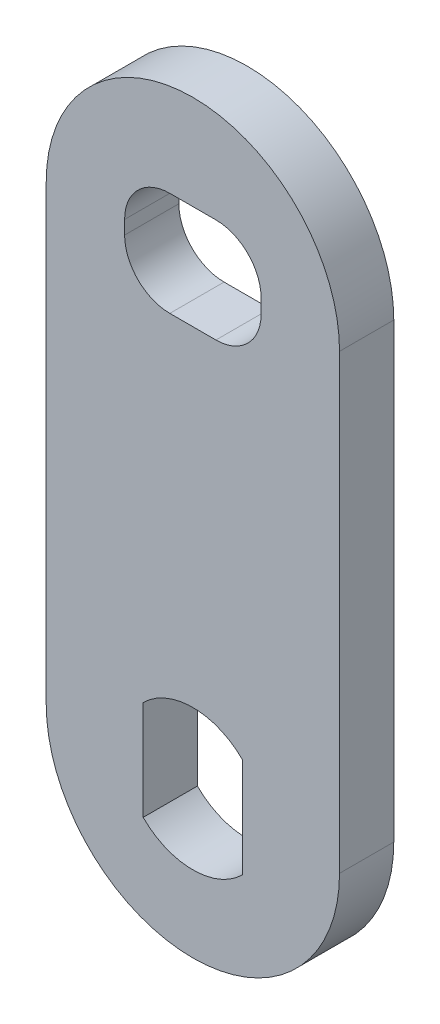
ISO-10303-21;
HEADER;
FILE_DESCRIPTION(('STEP AP214'),'2;1');
FILE_NAME('part.step','',(''),(''),'','','');
FILE_SCHEMA(('AUTOMOTIVE_DESIGN { 1 0 10303 214 1 1 1 1 }'));
ENDSEC;
DATA;
#1=APPLICATION_CONTEXT('core data for automotive mechanical design processes');
#2=APPLICATION_PROTOCOL_DEFINITION('international standard','automotive_design',2000,#1);
#3=PRODUCT_CONTEXT('',#1,'mechanical');
#4=PRODUCT('Part','Part','',(#3));
#5=PRODUCT_RELATED_PRODUCT_CATEGORY('part','',(#4));
#6=PRODUCT_DEFINITION_FORMATION('','',#4);
#7=PRODUCT_DEFINITION_CONTEXT('part definition',#1,'design');
#8=PRODUCT_DEFINITION('design','',#6,#7);
#9=PRODUCT_DEFINITION_SHAPE('','',#8);
#10=(LENGTH_UNIT() NAMED_UNIT(*) SI_UNIT(.MILLI.,.METRE.));
#11=(NAMED_UNIT(*) PLANE_ANGLE_UNIT() SI_UNIT($,.RADIAN.));
#12=(NAMED_UNIT(*) SI_UNIT($,.STERADIAN.) SOLID_ANGLE_UNIT());
#13=UNCERTAINTY_MEASURE_WITH_UNIT(LENGTH_MEASURE(1.E-05),#10,'distance_accuracy_value','');
#14=(GEOMETRIC_REPRESENTATION_CONTEXT(3) GLOBAL_UNCERTAINTY_ASSIGNED_CONTEXT((#13)) GLOBAL_UNIT_ASSIGNED_CONTEXT((#10,
#11,#12)) REPRESENTATION_CONTEXT('',''));
#15=CARTESIAN_POINT('',(0.,0.,0.));
#16=DIRECTION('',(0.,0.,1.));
#17=DIRECTION('',(1.,0.,0.));
#18=AXIS2_PLACEMENT_3D('',#15,#16,#17);
#19=CARTESIAN_POINT('',(0.,-12.5,3.));
#20=DIRECTION('',(0.,0.,1.));
#21=DIRECTION('',(1.,0.,0.));
#22=AXIS2_PLACEMENT_3D('',#19,#20,#21);
#23=PLANE('',#22);
#24=CARTESIAN_POINT('',(0.,-12.5,3.));
#25=DIRECTION('',(0.,0.,1.));
#26=DIRECTION('',(1.,0.,0.));
#27=AXIS2_PLACEMENT_3D('',#24,#25,#26);
#28=CIRCLE('',#27,3.88908729652601);
#29=CARTESIAN_POINT('',(-2.74999999999999,-15.25,3.));
#30=VERTEX_POINT('',#29);
#31=CARTESIAN_POINT('',(2.75000000000001,-15.25,3.));
#32=VERTEX_POINT('',#31);
#33=EDGE_CURVE('E47',#30,#32,#28,.T.);
#34=ORIENTED_EDGE('',*,*,#33,.F.);
#35=DIRECTION('',(0.,-1.,0.));
#36=VECTOR('',#35,1.);
#37=CARTESIAN_POINT('',(-2.74999999999999,-9.75,3.));
#38=LINE('',#37,#36);
#39=CARTESIAN_POINT('',(-2.74999999999999,-9.75,3.));
#40=VERTEX_POINT('',#39);
#41=EDGE_CURVE('E162',#40,#30,#38,.T.);
#42=ORIENTED_EDGE('',*,*,#41,.F.);
#43=CARTESIAN_POINT('',(0.,-12.5,3.));
#44=DIRECTION('',(0.,0.,1.));
#45=DIRECTION('',(1.,0.,0.));
#46=AXIS2_PLACEMENT_3D('',#43,#44,#45);
#47=CIRCLE('',#46,3.88908729652601);
#48=CARTESIAN_POINT('',(2.75000000000001,-9.75,3.));
#49=VERTEX_POINT('',#48);
#50=EDGE_CURVE('E165',#49,#40,#47,.T.);
#51=ORIENTED_EDGE('',*,*,#50,.F.);
#52=DIRECTION('',(0.,1.,0.));
#53=VECTOR('',#52,1.);
#54=CARTESIAN_POINT('',(2.75000000000001,-9.75,3.));
#55=LINE('',#54,#53);
#56=EDGE_CURVE('E171',#32,#49,#55,.T.);
#57=ORIENTED_EDGE('',*,*,#56,.F.);
#58=EDGE_LOOP('',(#34,#42,#51,#57));
#59=FACE_BOUND('',#58,.T.);
#60=CARTESIAN_POINT('',(0.,-12.5,3.));
#61=DIRECTION('',(0.,0.,1.));
#62=DIRECTION('',(1.,0.,0.));
#63=AXIS2_PLACEMENT_3D('',#60,#61,#62);
#64=CIRCLE('',#63,8.11);
#65=CARTESIAN_POINT('',(-8.10999999999999,-12.5,3.));
#66=VERTEX_POINT('',#65);
#67=CARTESIAN_POINT('',(8.11000000000001,-12.5,3.));
#68=VERTEX_POINT('',#67);
#69=EDGE_CURVE('E205',#66,#68,#64,.T.);
#70=ORIENTED_EDGE('',*,*,#69,.T.);
#71=DIRECTION('',(0.,1.,0.));
#72=VECTOR('',#71,1.);
#73=CARTESIAN_POINT('',(8.11000000000001,12.5,3.));
#74=LINE('',#73,#72);
#75=CARTESIAN_POINT('',(8.11000000000001,12.5,3.));
#76=VERTEX_POINT('',#75);
#77=EDGE_CURVE('E208',#68,#76,#74,.T.);
#78=ORIENTED_EDGE('',*,*,#77,.T.);
#79=CARTESIAN_POINT('',(0.,12.5,3.));
#80=DIRECTION('',(0.,0.,1.));
#81=DIRECTION('',(1.,0.,0.));
#82=AXIS2_PLACEMENT_3D('',#79,#80,#81);
#83=CIRCLE('',#82,8.11);
#84=CARTESIAN_POINT('',(-8.10999999999999,12.5,3.));
#85=VERTEX_POINT('',#84);
#86=EDGE_CURVE('E211',#76,#85,#83,.T.);
#87=ORIENTED_EDGE('',*,*,#86,.T.);
#88=DIRECTION('',(0.,-1.,0.));
#89=VECTOR('',#88,1.);
#90=CARTESIAN_POINT('',(-8.10999999999999,12.5,3.));
#91=LINE('',#90,#89);
#92=EDGE_CURVE('E213',#85,#66,#91,.T.);
#93=ORIENTED_EDGE('',*,*,#92,.T.);
#94=EDGE_LOOP('',(#70,#78,#87,#93));
#95=FACE_BOUND('',#94,.T.);
#96=DIRECTION('',(-1.,0.,0.));
#97=VECTOR('',#96,1.);
#98=CARTESIAN_POINT('',(-3.77499999999999,15.375,3.));
#99=LINE('',#98,#97);
#100=CARTESIAN_POINT('',(1.27500000000001,15.375,3.));
#101=VERTEX_POINT('',#100);
#102=CARTESIAN_POINT('',(-1.27499999999999,15.375,3.));
#103=VERTEX_POINT('',#102);
#104=EDGE_CURVE('E184',#101,#103,#99,.T.);
#105=ORIENTED_EDGE('',*,*,#104,.F.);
#106=CARTESIAN_POINT('',(1.27500000000001,12.875,3.));
#107=DIRECTION('',(0.,0.,1.));
#108=DIRECTION('',(1.,0.,0.));
#109=AXIS2_PLACEMENT_3D('',#106,#107,#108);
#110=CIRCLE('',#109,2.5);
#111=CARTESIAN_POINT('',(3.77500000000001,12.875,3.));
#112=VERTEX_POINT('',#111);
#113=EDGE_CURVE('E260',#101,#112,#110,.F.);
#114=ORIENTED_EDGE('',*,*,#113,.T.);
#115=DIRECTION('',(0.,1.,0.));
#116=VECTOR('',#115,1.);
#117=CARTESIAN_POINT('',(3.77500000000001,15.375,3.));
#118=LINE('',#117,#116);
#119=CARTESIAN_POINT('',(3.77500000000001,12.125,3.));
#120=VERTEX_POINT('',#119);
#121=EDGE_CURVE('E181',#120,#112,#118,.T.);
#122=ORIENTED_EDGE('',*,*,#121,.F.);
#123=CARTESIAN_POINT('',(1.27500000000001,12.125,3.));
#124=DIRECTION('',(0.,0.,1.));
#125=DIRECTION('',(1.,0.,0.));
#126=AXIS2_PLACEMENT_3D('',#123,#124,#125);
#127=CIRCLE('',#126,2.5);
#128=CARTESIAN_POINT('',(1.27500000000001,9.625,3.));
#129=VERTEX_POINT('',#128);
#130=EDGE_CURVE('E256',#120,#129,#127,.F.);
#131=ORIENTED_EDGE('',*,*,#130,.T.);
#132=DIRECTION('',(1.,0.,0.));
#133=VECTOR('',#132,1.);
#134=CARTESIAN_POINT('',(-3.77499999999999,9.625,3.));
#135=LINE('',#134,#133);
#136=CARTESIAN_POINT('',(-1.27499999999999,9.625,3.));
#137=VERTEX_POINT('',#136);
#138=EDGE_CURVE('E191',#137,#129,#135,.T.);
#139=ORIENTED_EDGE('',*,*,#138,.F.);
#140=CARTESIAN_POINT('',(-1.27499999999999,12.125,3.));
#141=DIRECTION('',(0.,0.,1.));
#142=DIRECTION('',(1.,0.,0.));
#143=AXIS2_PLACEMENT_3D('',#140,#141,#142);
#144=CIRCLE('',#143,2.5);
#145=CARTESIAN_POINT('',(-3.77499999999999,12.125,3.));
#146=VERTEX_POINT('',#145);
#147=EDGE_CURVE('E264',#137,#146,#144,.F.);
#148=ORIENTED_EDGE('',*,*,#147,.T.);
#149=DIRECTION('',(0.,-1.,0.));
#150=VECTOR('',#149,1.);
#151=CARTESIAN_POINT('',(-3.77499999999999,15.375,3.));
#152=LINE('',#151,#150);
#153=CARTESIAN_POINT('',(-3.77499999999999,12.875,3.));
#154=VERTEX_POINT('',#153);
#155=EDGE_CURVE('E188',#154,#146,#152,.T.);
#156=ORIENTED_EDGE('',*,*,#155,.F.);
#157=CARTESIAN_POINT('',(-1.27499999999999,12.875,3.));
#158=DIRECTION('',(0.,0.,1.));
#159=DIRECTION('',(1.,0.,0.));
#160=AXIS2_PLACEMENT_3D('',#157,#158,#159);
#161=CIRCLE('',#160,2.5);
#162=EDGE_CURVE('E11',#154,#103,#161,.F.);
#163=ORIENTED_EDGE('',*,*,#162,.T.);
#164=EDGE_LOOP('',(#105,#114,#122,#131,#139,#148,#156,#163));
#165=FACE_BOUND('',#164,.T.);
#166=ADVANCED_FACE('F32',(#59,#95,#165),#23,.T.);
#167=CARTESIAN_POINT('',(0.,-12.5,0.));
#168=DIRECTION('',(0.,0.,1.));
#169=DIRECTION('',(1.,0.,0.));
#170=AXIS2_PLACEMENT_3D('',#167,#168,#169);
#171=PLANE('',#170);
#172=DIRECTION('',(0.,-1.,0.));
#173=VECTOR('',#172,1.);
#174=CARTESIAN_POINT('',(-2.74999999999999,-9.75,0.));
#175=LINE('',#174,#173);
#176=CARTESIAN_POINT('',(-2.74999999999999,-9.75,0.));
#177=VERTEX_POINT('',#176);
#178=CARTESIAN_POINT('',(-2.74999999999999,-15.25,0.));
#179=VERTEX_POINT('',#178);
#180=EDGE_CURVE('E152',#177,#179,#175,.T.);
#181=ORIENTED_EDGE('',*,*,#180,.T.);
#182=CARTESIAN_POINT('',(0.,-12.5,0.));
#183=DIRECTION('',(0.,0.,1.));
#184=DIRECTION('',(1.,0.,0.));
#185=AXIS2_PLACEMENT_3D('',#182,#183,#184);
#186=CIRCLE('',#185,3.88908729652601);
#187=CARTESIAN_POINT('',(2.75000000000001,-15.25,0.));
#188=VERTEX_POINT('',#187);
#189=EDGE_CURVE('E146',#179,#188,#186,.T.);
#190=ORIENTED_EDGE('',*,*,#189,.T.);
#191=DIRECTION('',(0.,1.,0.));
#192=VECTOR('',#191,1.);
#193=CARTESIAN_POINT('',(2.75000000000001,-9.75,0.));
#194=LINE('',#193,#192);
#195=CARTESIAN_POINT('',(2.75000000000001,-9.75,0.));
#196=VERTEX_POINT('',#195);
#197=EDGE_CURVE('E155',#188,#196,#194,.T.);
#198=ORIENTED_EDGE('',*,*,#197,.T.);
#199=CARTESIAN_POINT('',(0.,-12.5,0.));
#200=DIRECTION('',(0.,0.,1.));
#201=DIRECTION('',(1.,0.,0.));
#202=AXIS2_PLACEMENT_3D('',#199,#200,#201);
#203=CIRCLE('',#202,3.88908729652601);
#204=EDGE_CURVE('E55',#196,#177,#203,.T.);
#205=ORIENTED_EDGE('',*,*,#204,.T.);
#206=EDGE_LOOP('',(#181,#190,#198,#205));
#207=FACE_BOUND('',#206,.T.);
#208=CARTESIAN_POINT('',(0.,-12.5,0.));
#209=DIRECTION('',(0.,0.,1.));
#210=DIRECTION('',(1.,0.,0.));
#211=AXIS2_PLACEMENT_3D('',#208,#209,#210);
#212=CIRCLE('',#211,8.11);
#213=CARTESIAN_POINT('',(-8.10999999999999,-12.5,0.));
#214=VERTEX_POINT('',#213);
#215=CARTESIAN_POINT('',(8.11000000000001,-12.5,0.));
#216=VERTEX_POINT('',#215);
#217=EDGE_CURVE('E194',#214,#216,#212,.T.);
#218=ORIENTED_EDGE('',*,*,#217,.F.);
#219=DIRECTION('',(0.,-1.,0.));
#220=VECTOR('',#219,1.);
#221=CARTESIAN_POINT('',(-8.10999999999999,12.5,0.));
#222=LINE('',#221,#220);
#223=CARTESIAN_POINT('',(-8.10999999999999,12.5,0.));
#224=VERTEX_POINT('',#223);
#225=EDGE_CURVE('E209',#224,#214,#222,.T.);
#226=ORIENTED_EDGE('',*,*,#225,.F.);
#227=CARTESIAN_POINT('',(0.,12.5,0.));
#228=DIRECTION('',(0.,0.,1.));
#229=DIRECTION('',(1.,0.,0.));
#230=AXIS2_PLACEMENT_3D('',#227,#228,#229);
#231=CIRCLE('',#230,8.11);
#232=CARTESIAN_POINT('',(8.11000000000001,12.5,0.));
#233=VERTEX_POINT('',#232);
#234=EDGE_CURVE('E220',#233,#224,#231,.T.);
#235=ORIENTED_EDGE('',*,*,#234,.F.);
#236=DIRECTION('',(0.,1.,0.));
#237=VECTOR('',#236,1.);
#238=CARTESIAN_POINT('',(8.11000000000001,12.5,0.));
#239=LINE('',#238,#237);
#240=EDGE_CURVE('E218',#216,#233,#239,.T.);
#241=ORIENTED_EDGE('',*,*,#240,.F.);
#242=EDGE_LOOP('',(#218,#226,#235,#241));
#243=FACE_BOUND('',#242,.T.);
#244=DIRECTION('',(1.,0.,0.));
#245=VECTOR('',#244,1.);
#246=CARTESIAN_POINT('',(-3.77499999999999,9.625,0.));
#247=LINE('',#246,#245);
#248=CARTESIAN_POINT('',(-1.27499999999999,9.625,0.));
#249=VERTEX_POINT('',#248);
#250=CARTESIAN_POINT('',(1.27500000000001,9.625,0.));
#251=VERTEX_POINT('',#250);
#252=EDGE_CURVE('E185',#249,#251,#247,.T.);
#253=ORIENTED_EDGE('',*,*,#252,.T.);
#254=CARTESIAN_POINT('',(1.27500000000001,12.125,0.));
#255=DIRECTION('',(0.,0.,1.));
#256=DIRECTION('',(1.,0.,0.));
#257=AXIS2_PLACEMENT_3D('',#254,#255,#256);
#258=CIRCLE('',#257,2.5);
#259=CARTESIAN_POINT('',(3.77500000000001,12.125,0.));
#260=VERTEX_POINT('',#259);
#261=EDGE_CURVE('E254',#251,#260,#258,.T.);
#262=ORIENTED_EDGE('',*,*,#261,.T.);
#263=DIRECTION('',(0.,1.,0.));
#264=VECTOR('',#263,1.);
#265=CARTESIAN_POINT('',(3.77500000000001,15.375,0.));
#266=LINE('',#265,#264);
#267=CARTESIAN_POINT('',(3.77500000000001,12.875,0.));
#268=VERTEX_POINT('',#267);
#269=EDGE_CURVE('E177',#260,#268,#266,.T.);
#270=ORIENTED_EDGE('',*,*,#269,.T.);
#271=CARTESIAN_POINT('',(1.27500000000001,12.875,0.));
#272=DIRECTION('',(0.,0.,1.));
#273=DIRECTION('',(1.,0.,0.));
#274=AXIS2_PLACEMENT_3D('',#271,#272,#273);
#275=CIRCLE('',#274,2.5);
#276=CARTESIAN_POINT('',(1.27500000000001,15.375,0.));
#277=VERTEX_POINT('',#276);
#278=EDGE_CURVE('E258',#268,#277,#275,.T.);
#279=ORIENTED_EDGE('',*,*,#278,.T.);
#280=DIRECTION('',(-1.,0.,0.));
#281=VECTOR('',#280,1.);
#282=CARTESIAN_POINT('',(-3.77499999999999,15.375,0.));
#283=LINE('',#282,#281);
#284=CARTESIAN_POINT('',(-1.27499999999999,15.375,0.));
#285=VERTEX_POINT('',#284);
#286=EDGE_CURVE('E197',#277,#285,#283,.T.);
#287=ORIENTED_EDGE('',*,*,#286,.T.);
#288=CARTESIAN_POINT('',(-1.27499999999999,12.875,0.));
#289=DIRECTION('',(0.,0.,1.));
#290=DIRECTION('',(1.,0.,0.));
#291=AXIS2_PLACEMENT_3D('',#288,#289,#290);
#292=CIRCLE('',#291,2.5);
#293=CARTESIAN_POINT('',(-3.77499999999999,12.875,0.));
#294=VERTEX_POINT('',#293);
#295=EDGE_CURVE('E40',#285,#294,#292,.T.);
#296=ORIENTED_EDGE('',*,*,#295,.T.);
#297=DIRECTION('',(0.,-1.,0.));
#298=VECTOR('',#297,1.);
#299=CARTESIAN_POINT('',(-3.77499999999999,15.375,0.));
#300=LINE('',#299,#298);
#301=CARTESIAN_POINT('',(-3.77499999999999,12.125,0.));
#302=VERTEX_POINT('',#301);
#303=EDGE_CURVE('E200',#294,#302,#300,.T.);
#304=ORIENTED_EDGE('',*,*,#303,.T.);
#305=CARTESIAN_POINT('',(-1.27499999999999,12.125,0.));
#306=DIRECTION('',(0.,0.,1.));
#307=DIRECTION('',(1.,0.,0.));
#308=AXIS2_PLACEMENT_3D('',#305,#306,#307);
#309=CIRCLE('',#308,2.5);
#310=EDGE_CURVE('E262',#302,#249,#309,.T.);
#311=ORIENTED_EDGE('',*,*,#310,.T.);
#312=EDGE_LOOP('',(#253,#262,#270,#279,#287,#296,#304,#311));
#313=FACE_BOUND('',#312,.T.);
#314=ADVANCED_FACE('F159',(#207,#243,#313),#171,.F.);
#315=CARTESIAN_POINT('',(0.,-12.5,3.));
#316=DIRECTION('',(0.,0.,-1.));
#317=DIRECTION('',(-1.,0.,0.));
#318=AXIS2_PLACEMENT_3D('',#315,#316,#317);
#319=CYLINDRICAL_SURFACE('',#318,8.11);
#320=ORIENTED_EDGE('',*,*,#217,.T.);
#321=DIRECTION('',(0.,0.,-1.));
#322=VECTOR('',#321,1.);
#323=CARTESIAN_POINT('',(8.11000000000001,-12.5,3.));
#324=LINE('',#323,#322);
#325=EDGE_CURVE('E231',#68,#216,#324,.T.);
#326=ORIENTED_EDGE('',*,*,#325,.F.);
#327=ORIENTED_EDGE('',*,*,#69,.F.);
#328=DIRECTION('',(0.,0.,-1.));
#329=VECTOR('',#328,1.);
#330=CARTESIAN_POINT('',(-8.10999999999999,-12.5,3.));
#331=LINE('',#330,#329);
#332=EDGE_CURVE('E215',#66,#214,#331,.T.);
#333=ORIENTED_EDGE('',*,*,#332,.T.);
#334=EDGE_LOOP('',(#320,#326,#327,#333));
#335=FACE_BOUND('',#334,.T.);
#336=ADVANCED_FACE('F314',(#335),#319,.T.);
#337=CARTESIAN_POINT('',(8.11000000000001,12.5,3.));
#338=DIRECTION('',(-1.,0.,0.));
#339=DIRECTION('',(0.,-1.,0.));
#340=AXIS2_PLACEMENT_3D('',#337,#338,#339);
#341=PLANE('',#340);
#342=ORIENTED_EDGE('',*,*,#240,.T.);
#343=DIRECTION('',(0.,0.,-1.));
#344=VECTOR('',#343,1.);
#345=CARTESIAN_POINT('',(8.11000000000001,12.5,3.));
#346=LINE('',#345,#344);
#347=EDGE_CURVE('E228',#76,#233,#346,.T.);
#348=ORIENTED_EDGE('',*,*,#347,.F.);
#349=ORIENTED_EDGE('',*,*,#77,.F.);
#350=ORIENTED_EDGE('',*,*,#325,.T.);
#351=EDGE_LOOP('',(#342,#348,#349,#350));
#352=FACE_BOUND('',#351,.T.);
#353=ADVANCED_FACE('F327',(#352),#341,.F.);
#354=CARTESIAN_POINT('',(0.,12.5,3.));
#355=DIRECTION('',(0.,0.,-1.));
#356=DIRECTION('',(-1.,0.,0.));
#357=AXIS2_PLACEMENT_3D('',#354,#355,#356);
#358=CYLINDRICAL_SURFACE('',#357,8.11);
#359=ORIENTED_EDGE('',*,*,#234,.T.);
#360=DIRECTION('',(0.,0.,-1.));
#361=VECTOR('',#360,1.);
#362=CARTESIAN_POINT('',(-8.10999999999999,12.5,3.));
#363=LINE('',#362,#361);
#364=EDGE_CURVE('E225',#85,#224,#363,.T.);
#365=ORIENTED_EDGE('',*,*,#364,.F.);
#366=ORIENTED_EDGE('',*,*,#86,.F.);
#367=ORIENTED_EDGE('',*,*,#347,.T.);
#368=EDGE_LOOP('',(#359,#365,#366,#367));
#369=FACE_BOUND('',#368,.T.);
#370=ADVANCED_FACE('F323',(#369),#358,.T.);
#371=CARTESIAN_POINT('',(-8.10999999999999,12.5,3.));
#372=DIRECTION('',(1.,0.,0.));
#373=DIRECTION('',(0.,1.,0.));
#374=AXIS2_PLACEMENT_3D('',#371,#372,#373);
#375=PLANE('',#374);
#376=ORIENTED_EDGE('',*,*,#225,.T.);
#377=ORIENTED_EDGE('',*,*,#332,.F.);
#378=ORIENTED_EDGE('',*,*,#92,.F.);
#379=ORIENTED_EDGE('',*,*,#364,.T.);
#380=EDGE_LOOP('',(#376,#377,#378,#379));
#381=FACE_BOUND('',#380,.T.);
#382=ADVANCED_FACE('F320',(#381),#375,.F.);
#383=CARTESIAN_POINT('',(3.77500000000001,15.375,3.));
#384=DIRECTION('',(-1.,0.,0.));
#385=DIRECTION('',(0.,-1.,0.));
#386=AXIS2_PLACEMENT_3D('',#383,#384,#385);
#387=PLANE('',#386);
#388=ORIENTED_EDGE('',*,*,#269,.F.);
#389=DIRECTION('',(0.,0.,-1.));
#390=VECTOR('',#389,1.);
#391=CARTESIAN_POINT('',(3.77500000000001,12.125,3.));
#392=LINE('',#391,#390);
#393=EDGE_CURVE('E242',#260,#120,#392,.F.);
#394=ORIENTED_EDGE('',*,*,#393,.T.);
#395=ORIENTED_EDGE('',*,*,#121,.T.);
#396=DIRECTION('',(0.,0.,-1.));
#397=VECTOR('',#396,1.);
#398=CARTESIAN_POINT('',(3.77500000000001,12.875,0.));
#399=LINE('',#398,#397);
#400=EDGE_CURVE('E239',#112,#268,#399,.T.);
#401=ORIENTED_EDGE('',*,*,#400,.T.);
#402=EDGE_LOOP('',(#388,#394,#395,#401));
#403=FACE_BOUND('',#402,.T.);
#404=ADVANCED_FACE('F289',(#403),#387,.T.);
#405=CARTESIAN_POINT('',(-3.77499999999999,15.375,3.));
#406=DIRECTION('',(0.,-1.,0.));
#407=DIRECTION('',(0.,0.,-1.));
#408=AXIS2_PLACEMENT_3D('',#405,#406,#407);
#409=PLANE('',#408);
#410=ORIENTED_EDGE('',*,*,#286,.F.);
#411=DIRECTION('',(0.,0.,-1.));
#412=VECTOR('',#411,1.);
#413=CARTESIAN_POINT('',(1.27500000000001,15.375,3.));
#414=LINE('',#413,#412);
#415=EDGE_CURVE('E247',#277,#101,#414,.F.);
#416=ORIENTED_EDGE('',*,*,#415,.T.);
#417=ORIENTED_EDGE('',*,*,#104,.T.);
#418=DIRECTION('',(0.,0.,-1.));
#419=VECTOR('',#418,1.);
#420=CARTESIAN_POINT('',(-1.27499999999999,15.375,0.));
#421=LINE('',#420,#419);
#422=EDGE_CURVE('E244',#103,#285,#421,.T.);
#423=ORIENTED_EDGE('',*,*,#422,.T.);
#424=EDGE_LOOP('',(#410,#416,#417,#423));
#425=FACE_BOUND('',#424,.T.);
#426=ADVANCED_FACE('F280',(#425),#409,.T.);
#427=CARTESIAN_POINT('',(-3.77499999999999,15.375,3.));
#428=DIRECTION('',(1.,0.,0.));
#429=DIRECTION('',(0.,1.,0.));
#430=AXIS2_PLACEMENT_3D('',#427,#428,#429);
#431=PLANE('',#430);
#432=ORIENTED_EDGE('',*,*,#155,.T.);
#433=DIRECTION('',(0.,0.,-1.));
#434=VECTOR('',#433,1.);
#435=CARTESIAN_POINT('',(-3.77499999999999,12.125,0.));
#436=LINE('',#435,#434);
#437=EDGE_CURVE('E251',#146,#302,#436,.T.);
#438=ORIENTED_EDGE('',*,*,#437,.T.);
#439=ORIENTED_EDGE('',*,*,#303,.F.);
#440=DIRECTION('',(0.,0.,-1.));
#441=VECTOR('',#440,1.);
#442=CARTESIAN_POINT('',(-3.77499999999999,12.875,3.));
#443=LINE('',#442,#441);
#444=EDGE_CURVE('E249',#294,#154,#443,.F.);
#445=ORIENTED_EDGE('',*,*,#444,.T.);
#446=EDGE_LOOP('',(#432,#438,#439,#445));
#447=FACE_BOUND('',#446,.T.);
#448=ADVANCED_FACE('F272',(#447),#431,.T.);
#449=CARTESIAN_POINT('',(-3.77499999999999,9.625,3.));
#450=DIRECTION('',(0.,1.,0.));
#451=DIRECTION('',(0.,0.,1.));
#452=AXIS2_PLACEMENT_3D('',#449,#450,#451);
#453=PLANE('',#452);
#454=ORIENTED_EDGE('',*,*,#138,.T.);
#455=DIRECTION('',(0.,0.,-1.));
#456=VECTOR('',#455,1.);
#457=CARTESIAN_POINT('',(1.27500000000001,9.625,0.));
#458=LINE('',#457,#456);
#459=EDGE_CURVE('E236',#129,#251,#458,.T.);
#460=ORIENTED_EDGE('',*,*,#459,.T.);
#461=ORIENTED_EDGE('',*,*,#252,.F.);
#462=DIRECTION('',(0.,0.,-1.));
#463=VECTOR('',#462,1.);
#464=CARTESIAN_POINT('',(-1.27499999999999,9.625,3.));
#465=LINE('',#464,#463);
#466=EDGE_CURVE('E234',#249,#137,#465,.F.);
#467=ORIENTED_EDGE('',*,*,#466,.T.);
#468=EDGE_LOOP('',(#454,#460,#461,#467));
#469=FACE_BOUND('',#468,.T.);
#470=ADVANCED_FACE('F297',(#469),#453,.T.);
#471=CARTESIAN_POINT('',(1.27500000000001,12.125,3.));
#472=DIRECTION('',(0.,0.,1.));
#473=DIRECTION('',(1.,0.,0.));
#474=AXIS2_PLACEMENT_3D('',#471,#472,#473);
#475=CYLINDRICAL_SURFACE('',#474,2.5);
#476=ORIENTED_EDGE('',*,*,#130,.F.);
#477=ORIENTED_EDGE('',*,*,#393,.F.);
#478=ORIENTED_EDGE('',*,*,#261,.F.);
#479=ORIENTED_EDGE('',*,*,#459,.F.);
#480=EDGE_LOOP('',(#476,#477,#478,#479));
#481=FACE_BOUND('',#480,.T.);
#482=ADVANCED_FACE('F292',(#481),#475,.F.);
#483=CARTESIAN_POINT('',(1.27500000000001,12.875,3.));
#484=DIRECTION('',(0.,0.,1.));
#485=DIRECTION('',(1.,0.,0.));
#486=AXIS2_PLACEMENT_3D('',#483,#484,#485);
#487=CYLINDRICAL_SURFACE('',#486,2.5);
#488=ORIENTED_EDGE('',*,*,#113,.F.);
#489=ORIENTED_EDGE('',*,*,#415,.F.);
#490=ORIENTED_EDGE('',*,*,#278,.F.);
#491=ORIENTED_EDGE('',*,*,#400,.F.);
#492=EDGE_LOOP('',(#488,#489,#490,#491));
#493=FACE_BOUND('',#492,.T.);
#494=ADVANCED_FACE('F283',(#493),#487,.F.);
#495=CARTESIAN_POINT('',(-1.27499999999999,12.125,3.));
#496=DIRECTION('',(0.,0.,1.));
#497=DIRECTION('',(1.,0.,0.));
#498=AXIS2_PLACEMENT_3D('',#495,#496,#497);
#499=CYLINDRICAL_SURFACE('',#498,2.5);
#500=ORIENTED_EDGE('',*,*,#147,.F.);
#501=ORIENTED_EDGE('',*,*,#466,.F.);
#502=ORIENTED_EDGE('',*,*,#310,.F.);
#503=ORIENTED_EDGE('',*,*,#437,.F.);
#504=EDGE_LOOP('',(#500,#501,#502,#503));
#505=FACE_BOUND('',#504,.T.);
#506=ADVANCED_FACE('F301',(#505),#499,.F.);
#507=CARTESIAN_POINT('',(-1.27499999999999,12.875,3.));
#508=DIRECTION('',(0.,0.,1.));
#509=DIRECTION('',(1.,0.,0.));
#510=AXIS2_PLACEMENT_3D('',#507,#508,#509);
#511=CYLINDRICAL_SURFACE('',#510,2.5);
#512=ORIENTED_EDGE('',*,*,#162,.F.);
#513=ORIENTED_EDGE('',*,*,#444,.F.);
#514=ORIENTED_EDGE('',*,*,#295,.F.);
#515=ORIENTED_EDGE('',*,*,#422,.F.);
#516=EDGE_LOOP('',(#512,#513,#514,#515));
#517=FACE_BOUND('',#516,.T.);
#518=ADVANCED_FACE('F34',(#517),#511,.F.);
#519=CARTESIAN_POINT('',(0.,-12.5,0.));
#520=DIRECTION('',(0.,0.,1.));
#521=DIRECTION('',(1.,0.,0.));
#522=AXIS2_PLACEMENT_3D('',#519,#520,#521);
#523=CYLINDRICAL_SURFACE('',#522,3.88908729652601);
#524=ORIENTED_EDGE('',*,*,#33,.T.);
#525=DIRECTION('',(0.,0.,1.));
#526=VECTOR('',#525,1.);
#527=CARTESIAN_POINT('',(2.75000000000001,-15.25,0.));
#528=LINE('',#527,#526);
#529=EDGE_CURVE('E142',#188,#32,#528,.T.);
#530=ORIENTED_EDGE('',*,*,#529,.F.);
#531=ORIENTED_EDGE('',*,*,#189,.F.);
#532=DIRECTION('',(0.,0.,1.));
#533=VECTOR('',#532,1.);
#534=CARTESIAN_POINT('',(-2.74999999999999,-15.25,0.));
#535=LINE('',#534,#533);
#536=EDGE_CURVE('E175',#179,#30,#535,.T.);
#537=ORIENTED_EDGE('',*,*,#536,.T.);
#538=EDGE_LOOP('',(#524,#530,#531,#537));
#539=FACE_BOUND('',#538,.T.);
#540=ADVANCED_FACE('F144',(#539),#523,.F.);
#541=CARTESIAN_POINT('',(-2.74999999999999,-9.75,0.));
#542=DIRECTION('',(-1.,0.,0.));
#543=DIRECTION('',(0.,-1.,0.));
#544=AXIS2_PLACEMENT_3D('',#541,#542,#543);
#545=PLANE('',#544);
#546=ORIENTED_EDGE('',*,*,#41,.T.);
#547=ORIENTED_EDGE('',*,*,#536,.F.);
#548=ORIENTED_EDGE('',*,*,#180,.F.);
#549=DIRECTION('',(0.,0.,1.));
#550=VECTOR('',#549,1.);
#551=CARTESIAN_POINT('',(-2.74999999999999,-9.75,0.));
#552=LINE('',#551,#550);
#553=EDGE_CURVE('E178',#177,#40,#552,.T.);
#554=ORIENTED_EDGE('',*,*,#553,.T.);
#555=EDGE_LOOP('',(#546,#547,#548,#554));
#556=FACE_BOUND('',#555,.T.);
#557=ADVANCED_FACE('F384',(#556),#545,.F.);
#558=CARTESIAN_POINT('',(0.,-12.5,0.));
#559=DIRECTION('',(0.,0.,1.));
#560=DIRECTION('',(1.,0.,0.));
#561=AXIS2_PLACEMENT_3D('',#558,#559,#560);
#562=CYLINDRICAL_SURFACE('',#561,3.88908729652601);
#563=ORIENTED_EDGE('',*,*,#50,.T.);
#564=ORIENTED_EDGE('',*,*,#553,.F.);
#565=ORIENTED_EDGE('',*,*,#204,.F.);
#566=DIRECTION('',(0.,0.,1.));
#567=VECTOR('',#566,1.);
#568=CARTESIAN_POINT('',(2.75000000000001,-9.75,0.));
#569=LINE('',#568,#567);
#570=EDGE_CURVE('E151',#196,#49,#569,.T.);
#571=ORIENTED_EDGE('',*,*,#570,.T.);
#572=EDGE_LOOP('',(#563,#564,#565,#571));
#573=FACE_BOUND('',#572,.T.);
#574=ADVANCED_FACE('F393',(#573),#562,.F.);
#575=CARTESIAN_POINT('',(2.75000000000001,-9.75,0.));
#576=DIRECTION('',(1.,0.,0.));
#577=DIRECTION('',(0.,1.,0.));
#578=AXIS2_PLACEMENT_3D('',#575,#576,#577);
#579=PLANE('',#578);
#580=ORIENTED_EDGE('',*,*,#56,.T.);
#581=ORIENTED_EDGE('',*,*,#570,.F.);
#582=ORIENTED_EDGE('',*,*,#197,.F.);
#583=ORIENTED_EDGE('',*,*,#529,.T.);
#584=EDGE_LOOP('',(#580,#581,#582,#583));
#585=FACE_BOUND('',#584,.T.);
#586=ADVANCED_FACE('F156',(#585),#579,.F.);
#587=CLOSED_SHELL('',(#166,#314,#336,#353,#370,#382,#404,#426,#448,#470,#482,#494,#506,#518,
#540,#557,#574,#586));
#588=MANIFOLD_SOLID_BREP('B2',#587);
#589=ADVANCED_BREP_SHAPE_REPRESENTATION('',(#18,#588),#14);
#590=SHAPE_DEFINITION_REPRESENTATION(#9,#589);
ENDSEC;
END-ISO-10303-21;
